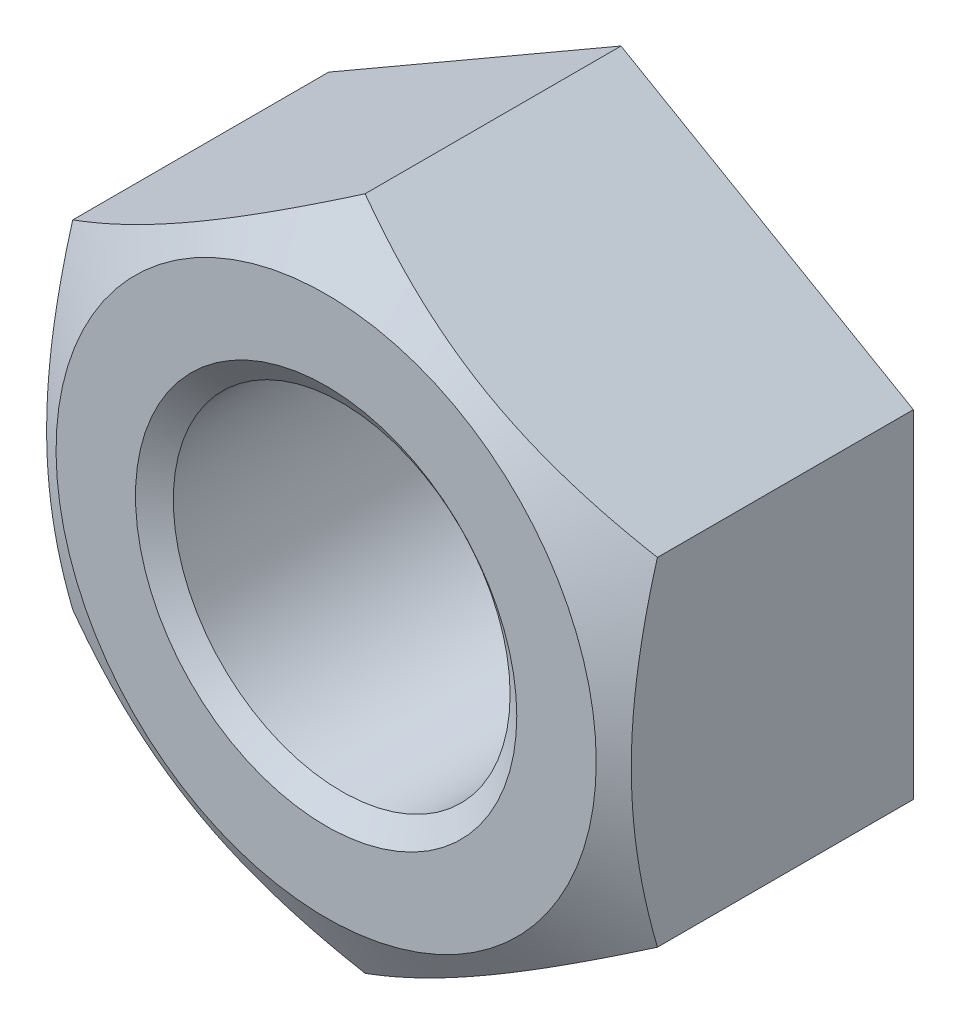
ISO-10303-21;
HEADER;
FILE_DESCRIPTION(('STEP AP214'),'2;1');
FILE_NAME('part.step','',(''),(''),'','','');
FILE_SCHEMA(('AUTOMOTIVE_DESIGN { 1 0 10303 214 1 1 1 1 }'));
ENDSEC;
DATA;
#1=APPLICATION_CONTEXT('core data for automotive mechanical design processes');
#2=APPLICATION_PROTOCOL_DEFINITION('international standard','automotive_design',2000,#1);
#3=PRODUCT_CONTEXT('',#1,'mechanical');
#4=PRODUCT('Part','Part','',(#3));
#5=PRODUCT_RELATED_PRODUCT_CATEGORY('part','',(#4));
#6=PRODUCT_DEFINITION_FORMATION('','',#4);
#7=PRODUCT_DEFINITION_CONTEXT('part definition',#1,'design');
#8=PRODUCT_DEFINITION('design','',#6,#7);
#9=PRODUCT_DEFINITION_SHAPE('','',#8);
#10=(LENGTH_UNIT() NAMED_UNIT(*) SI_UNIT(.MILLI.,.METRE.));
#11=(NAMED_UNIT(*) PLANE_ANGLE_UNIT() SI_UNIT($,.RADIAN.));
#12=(NAMED_UNIT(*) SI_UNIT($,.STERADIAN.) SOLID_ANGLE_UNIT());
#13=UNCERTAINTY_MEASURE_WITH_UNIT(LENGTH_MEASURE(1.E-05),#10,'distance_accuracy_value','');
#14=(GEOMETRIC_REPRESENTATION_CONTEXT(3) GLOBAL_UNCERTAINTY_ASSIGNED_CONTEXT((#13)) GLOBAL_UNIT_ASSIGNED_CONTEXT((#10,
#11,#12)) REPRESENTATION_CONTEXT('',''));
#15=CARTESIAN_POINT('',(0.,0.,0.));
#16=DIRECTION('',(0.,0.,1.));
#17=DIRECTION('',(1.,0.,0.));
#18=AXIS2_PLACEMENT_3D('',#15,#16,#17);
#19=CARTESIAN_POINT('',(0.,0.,-24.));
#20=DIRECTION('',(0.,0.,1.));
#21=DIRECTION('',(1.,0.,0.));
#22=AXIS2_PLACEMENT_3D('',#19,#20,#21);
#23=CYLINDRICAL_SURFACE('',#22,13.25);
#24=CARTESIAN_POINT('',(0.,0.,-1.22536319186699));
#25=DIRECTION('',(0.,0.,1.));
#26=DIRECTION('',(1.,0.,0.));
#27=AXIS2_PLACEMENT_3D('',#24,#25,#26);
#28=CIRCLE('',#27,13.25);
#29=CARTESIAN_POINT('',(13.25,0.,-1.22536319186699));
#30=VERTEX_POINT('',#29);
#31=EDGE_CURVE('E157',#30,#30,#28,.F.);
#32=ORIENTED_EDGE('',*,*,#31,.F.);
#33=EDGE_LOOP('',(#32));
#34=FACE_BOUND('',#33,.T.);
#35=CARTESIAN_POINT('',(0.,0.,-22.749236808133));
#36=DIRECTION('',(0.,0.,-1.));
#37=DIRECTION('',(-1.,0.,0.));
#38=AXIS2_PLACEMENT_3D('',#35,#36,#37);
#39=CIRCLE('',#38,13.25);
#40=CARTESIAN_POINT('',(-13.25,0.,-22.749236808133));
#41=VERTEX_POINT('',#40);
#42=EDGE_CURVE('E60',#41,#41,#39,.F.);
#43=ORIENTED_EDGE('',*,*,#42,.F.);
#44=EDGE_LOOP('',(#43));
#45=FACE_BOUND('',#44,.T.);
#46=ADVANCED_FACE('F55',(#34,#45),#23,.F.);
#47=CARTESIAN_POINT('',(0.,26.5581123827228,-24.));
#48=DIRECTION('',(-0.500000000000001,0.866025403784438,0.));
#49=DIRECTION('',(-0.866025403784438,-0.500000000000001,0.));
#50=AXIS2_PLACEMENT_3D('',#47,#48,#49);
#51=PLANE('',#50);
#52=DIRECTION('',(0.,0.,1.));
#53=VECTOR('',#52,1.);
#54=CARTESIAN_POINT('',(-23.,13.2790561913614,-24.));
#55=LINE('',#54,#53);
#56=CARTESIAN_POINT('',(-23.,13.2790561913614,-23.2));
#57=VERTEX_POINT('',#56);
#58=CARTESIAN_POINT('',(-23.,13.2790561913614,-3.06464011305381));
#59=VERTEX_POINT('',#58);
#60=EDGE_CURVE('E152',#57,#59,#55,.T.);
#61=ORIENTED_EDGE('',*,*,#60,.T.);
#62=CARTESIAN_POINT('',(-23.0002,13.2789407213075,-3.06470678015524));
#63=CARTESIAN_POINT('',(-22.4946699373268,13.5708086390754,-2.89620896296567));
#64=CARTESIAN_POINT('',(-21.9871680382127,13.8638149971431,-2.73535736277619));
#65=CARTESIAN_POINT('',(-20.9680946831029,14.4521772730397,-2.43107196426031));
#66=CARTESIAN_POINT('',(-20.4565219472494,14.7475339297949,-2.28764389460049));
#67=CARTESIAN_POINT('',(-19.4283073174286,15.3411739231066,-2.0201306965839));
#68=CARTESIAN_POINT('',(-18.9116563435469,15.6394625019543,-1.89609176031476));
#69=CARTESIAN_POINT('',(-17.874786357377,16.2380996675841,-1.67002891387056));
#70=CARTESIAN_POINT('',(-17.3545677058637,16.5384480460728,-1.56800281059486));
#71=CARTESIAN_POINT('',(-16.3238595850214,17.133527657097,-1.390296488012));
#72=CARTESIAN_POINT('',(-15.8134465686197,17.4282147495145,-1.31402859412605));
#73=CARTESIAN_POINT('',(-14.7902817837407,18.0189392134896,-1.18614472419415));
#74=CARTESIAN_POINT('',(-14.2775299704369,18.3149766109281,-1.13452922267139));
#75=CARTESIAN_POINT('',(-13.2511650180465,18.9075486924775,-1.05725340300737));
#76=CARTESIAN_POINT('',(-12.737553632351,19.2040823642676,-1.03156224268942));
#77=CARTESIAN_POINT('',(-11.709856889637,19.7974233553189,-1.00668758772433));
#78=CARTESIAN_POINT('',(-11.1957715477555,20.0942306658406,-1.0075032739647));
#79=CARTESIAN_POINT('',(-10.2346805073992,20.649116836706,-1.0337909434809));
#80=CARTESIAN_POINT('',(-9.78760635936283,20.9072352164226,-1.05605737734965));
#81=CARTESIAN_POINT('',(-8.89452539422337,21.422855752054,-1.12021466271131));
#82=CARTESIAN_POINT('',(-8.44851856192501,21.6803579167418,-1.16210523312609));
#83=CARTESIAN_POINT('',(-7.5577370141797,22.1946508831217,-1.26478478301267));
#84=CARTESIAN_POINT('',(-7.11296378131639,22.4514408288437,-1.3255908517859));
#85=CARTESIAN_POINT('',(-6.22554696928939,22.9637911641509,-1.46502523267661));
#86=CARTESIAN_POINT('',(-5.78290338111063,23.219351558941,-1.54365346928278));
#87=CARTESIAN_POINT('',(-4.43913170576541,23.9951784974309,-1.80828930440615));
#88=CARTESIAN_POINT('',(-3.54182151529442,24.513240777446,-2.02069846338397));
#89=CARTESIAN_POINT('',(-2.20576568085544,25.2846129731117,-2.38231509147428));
#90=CARTESIAN_POINT('',(-1.76244815667233,25.5405624650353,-2.50989098907509));
#91=CARTESIAN_POINT('',(-0.878879475119298,26.0506910811774,-2.77795827117694));
#92=CARTESIAN_POINT('',(-0.438627490903587,26.3048706827757,-2.9184460154237));
#93=CARTESIAN_POINT('',(0.000199999999999214,26.5582278527766,-3.06470678015525));
#94=B_SPLINE_CURVE_WITH_KNOTS('',3,(#62,#63,#64,#65,#66,#67,#68,#69,#70,#71,#72,#73,#74,#75,#76,
#77,#78,#79,#80,#81,#82,#83,#84,#85,#86,#87,#88,#89,#90,#91,#92,#93),.UNSPECIFIED.,.F.,.F.,(4,2,
2,2,2,2,2,2,2,2,2,2,2,2,2,4),(0.,1.82275209583971,3.64610187987774,5.47373144334345,
7.30117883905959,9.08355891739023,10.8659733025976,12.6462646412199,14.4265009654718,
15.9762768881921,17.5260306140232,19.0771885590146,20.6283399319781,23.7989683744784,
25.381520854309,26.9636285236953),.UNSPECIFIED.);
#95=CARTESIAN_POINT('',(0.,26.5581123827228,-3.06464011305381));
#96=VERTEX_POINT('',#95);
#97=EDGE_CURVE('E74',#59,#96,#94,.T.);
#98=ORIENTED_EDGE('',*,*,#97,.T.);
#99=DIRECTION('',(0.,0.,1.));
#100=VECTOR('',#99,1.);
#101=CARTESIAN_POINT('',(0.,26.5581123827228,-24.));
#102=LINE('',#101,#100);
#103=CARTESIAN_POINT('',(0.,26.5581123827228,-23.2));
#104=VERTEX_POINT('',#103);
#105=EDGE_CURVE('E66',#104,#96,#102,.T.);
#106=ORIENTED_EDGE('',*,*,#105,.F.);
#107=DIRECTION('',(-0.866025403784438,-0.500000000000001,0.));
#108=VECTOR('',#107,1.);
#109=CARTESIAN_POINT('',(0.,26.5581123827228,-23.2));
#110=LINE('',#109,#108);
#111=EDGE_CURVE('E155',#104,#57,#110,.T.);
#112=ORIENTED_EDGE('',*,*,#111,.T.);
#113=EDGE_LOOP('',(#61,#98,#106,#112));
#114=FACE_BOUND('',#113,.T.);
#115=ADVANCED_FACE('F57',(#114),#51,.T.);
#116=CARTESIAN_POINT('',(23.,13.2790561913614,-24.));
#117=DIRECTION('',(0.500000000000001,0.866025403784438,0.));
#118=DIRECTION('',(-0.866025403784438,0.500000000000001,0.));
#119=AXIS2_PLACEMENT_3D('',#116,#117,#118);
#120=PLANE('',#119);
#121=ORIENTED_EDGE('',*,*,#105,.T.);
#122=CARTESIAN_POINT('',(-0.000199999999998314,26.5582278527766,-3.06470678015525));
#123=CARTESIAN_POINT('',(0.505330062673217,26.2663599350088,-2.89620896296568));
#124=CARTESIAN_POINT('',(1.01283196178731,25.973353576941,-2.73535736277621));
#125=CARTESIAN_POINT('',(2.03190531689708,25.3849913010444,-2.43107196426032));
#126=CARTESIAN_POINT('',(2.54347805275062,25.0896346442893,-2.2876438946005));
#127=CARTESIAN_POINT('',(3.57169268257138,24.4959946509776,-2.02013069658391));
#128=CARTESIAN_POINT('',(4.08834365645312,24.1977060721299,-1.89609176031477));
#129=CARTESIAN_POINT('',(5.12521364262298,23.5990689065001,-1.67002891387056));
#130=CARTESIAN_POINT('',(5.64543229413635,23.2987205280114,-1.56800281059487));
#131=CARTESIAN_POINT('',(6.67614041497861,22.7036409169872,-1.390296488012));
#132=CARTESIAN_POINT('',(7.18655343138035,22.4089538245697,-1.31402859412605));
#133=CARTESIAN_POINT('',(8.20971821625926,21.8182293605945,-1.18614472419416));
#134=CARTESIAN_POINT('',(8.72247002956314,21.5221919631561,-1.13452922267139));
#135=CARTESIAN_POINT('',(9.74883498195349,20.9296198816067,-1.05725340300737));
#136=CARTESIAN_POINT('',(10.262446367649,20.6330862098165,-1.03156224268942));
#137=CARTESIAN_POINT('',(11.290143110363,20.0397452187653,-1.00668758772433));
#138=CARTESIAN_POINT('',(11.8042284522445,19.7429379082436,-1.0075032739647));
#139=CARTESIAN_POINT('',(12.7653194926008,19.1880517373781,-1.03379094348089));
#140=CARTESIAN_POINT('',(13.2123936406372,18.9299333576616,-1.05605737734965));
#141=CARTESIAN_POINT('',(14.1054746057766,18.4143128220302,-1.1202146627113));
#142=CARTESIAN_POINT('',(14.551481438075,18.1568106573423,-1.16210523312609));
#143=CARTESIAN_POINT('',(15.4422629858203,17.6425176909624,-1.26478478301267));
#144=CARTESIAN_POINT('',(15.8870362186836,17.3857277452405,-1.32559085178589));
#145=CARTESIAN_POINT('',(16.7744530307106,16.8733774099333,-1.4650252326766));
#146=CARTESIAN_POINT('',(17.2170966188894,16.6178170151432,-1.54365346928277));
#147=CARTESIAN_POINT('',(18.5608682942346,15.8419900766532,-1.80828930440614));
#148=CARTESIAN_POINT('',(19.4581784847056,15.3239277966382,-2.02069846338396));
#149=CARTESIAN_POINT('',(20.7942343191446,14.5525556009725,-2.38231509147426));
#150=CARTESIAN_POINT('',(21.2375518433277,14.2966061090489,-2.50989098907507));
#151=CARTESIAN_POINT('',(22.1211205248807,13.7864774929067,-2.77795827117692));
#152=CARTESIAN_POINT('',(22.5613725090964,13.5322978913085,-2.91844601542368));
#153=CARTESIAN_POINT('',(23.0002,13.2789407213075,-3.06470678015524));
#154=B_SPLINE_CURVE_WITH_KNOTS('',3,(#122,#123,#124,#125,#126,#127,#128,#129,#130,#131,#132,
#133,#134,#135,#136,#137,#138,#139,#140,#141,#142,#143,#144,#145,#146,#147,#148,#149,#150,#151,
#152,#153),.UNSPECIFIED.,.F.,.F.,(4,2,2,2,2,2,2,2,2,2,2,2,2,2,2,4),(0.,1.82275209583972,
3.64610187987774,5.47373144334346,7.3011788390596,9.08355891739024,10.8659733025977,
12.6462646412199,14.4265009654718,15.9762768881921,17.5260306140232,19.0771885590147,
20.6283399319781,23.7989683744784,25.381520854309,26.9636285236953),.UNSPECIFIED.);
#155=CARTESIAN_POINT('',(23.,13.2790561913614,-3.06464011305381));
#156=VERTEX_POINT('',#155);
#157=EDGE_CURVE('E112',#96,#156,#154,.T.);
#158=ORIENTED_EDGE('',*,*,#157,.T.);
#159=DIRECTION('',(0.,0.,1.));
#160=VECTOR('',#159,1.);
#161=CARTESIAN_POINT('',(23.,13.2790561913614,-24.));
#162=LINE('',#161,#160);
#163=CARTESIAN_POINT('',(23.,13.2790561913614,-23.2));
#164=VERTEX_POINT('',#163);
#165=EDGE_CURVE('E126',#164,#156,#162,.T.);
#166=ORIENTED_EDGE('',*,*,#165,.F.);
#167=DIRECTION('',(-0.866025403784438,0.500000000000001,0.));
#168=VECTOR('',#167,1.);
#169=CARTESIAN_POINT('',(23.,13.2790561913614,-23.2));
#170=LINE('',#169,#168);
#171=EDGE_CURVE('E297',#164,#104,#170,.T.);
#172=ORIENTED_EDGE('',*,*,#171,.T.);
#173=EDGE_LOOP('',(#121,#158,#166,#172));
#174=FACE_BOUND('',#173,.T.);
#175=ADVANCED_FACE('F124',(#174),#120,.T.);
#176=CARTESIAN_POINT('',(23.,13.2790561913614,-24.));
#177=DIRECTION('',(-1.,0.,0.));
#178=DIRECTION('',(0.,0.,1.));
#179=AXIS2_PLACEMENT_3D('',#176,#177,#178);
#180=PLANE('',#179);
#181=CARTESIAN_POINT('',(23.,-35.0780685485282,-11.9488685417644));
#182=CARTESIAN_POINT('',(23.,-34.5737134076575,-11.7053639974233));
#183=CARTESIAN_POINT('',(23.,-34.0687442458396,-11.4631273123191));
#184=CARTESIAN_POINT('',(23.,-33.057448994533,-10.9814892515945));
#185=CARTESIAN_POINT('',(23.,-32.5511228899599,-10.7420879076548));
#186=CARTESIAN_POINT('',(23.,-31.5369087506203,-10.2663845898492));
#187=CARTESIAN_POINT('',(23.,-31.0290204617527,-10.0300831571396));
#188=CARTESIAN_POINT('',(23.,-30.0116313487155,-9.56098370794906));
#189=CARTESIAN_POINT('',(23.,-29.5021305287171,-9.32818568241469));
#190=CARTESIAN_POINT('',(23.,-27.9650624821132,-8.63295496672951));
#191=CARTESIAN_POINT('',(23.,-26.934799872794,-8.17644978276591));
#192=CARTESIAN_POINT('',(23.,-24.8657625137666,-7.28323976773637));
#193=CARTESIAN_POINT('',(23.,-23.8269882160104,-6.84653389331184));
#194=CARTESIAN_POINT('',(23.,-21.7270262329022,-5.99329263988917));
#195=CARTESIAN_POINT('',(23.,-20.665718406379,-5.57705134364039));
#196=CARTESIAN_POINT('',(23.,-18.5305279669218,-4.77751797307565));
#197=CARTESIAN_POINT('',(23.,-17.4566439650014,-4.39422957801947));
#198=CARTESIAN_POINT('',(23.,-15.2968805955229,-3.671008456395));
#199=CARTESIAN_POINT('',(23.,-14.2110327691444,-3.33098231768915));
#200=CARTESIAN_POINT('',(23.,-12.0238020945178,-2.70540300528951));
#201=CARTESIAN_POINT('',(23.,-10.9224243154918,-2.41983247911325));
#202=CARTESIAN_POINT('',(23.,-9.25849113099518,-2.04283349441315));
#203=CARTESIAN_POINT('',(23.,-8.70171998903924,-1.92570242599273));
#204=CARTESIAN_POINT('',(23.,-7.58450066355028,-1.71042696624684));
#205=CARTESIAN_POINT('',(23.,-7.02405256448527,-1.61228214033255));
#206=CARTESIAN_POINT('',(23.,-5.89986571988708,-1.43672700236951));
#207=CARTESIAN_POINT('',(23.,-5.33612676901825,-1.35931799859115));
#208=CARTESIAN_POINT('',(23.,-4.20601541066591,-1.22679384417972));
#209=CARTESIAN_POINT('',(23.,-3.63964299967368,-1.17167872325869));
#210=CARTESIAN_POINT('',(23.,-2.50860433755947,-1.08521863338888));
#211=CARTESIAN_POINT('',(23.,-1.9439492548038,-1.05372851585493));
#212=CARTESIAN_POINT('',(23.,-0.813815198672231,-1.01468181033294));
#213=CARTESIAN_POINT('',(23.,-0.248336237714084,-1.00712486527476));
#214=CARTESIAN_POINT('',(23.,0.882278627431273,-1.01612299200431));
#215=CARTESIAN_POINT('',(23.,1.44741458303895,-1.03267154214538));
#216=CARTESIAN_POINT('',(23.,2.57649778968015,-1.08947358836765));
#217=CARTESIAN_POINT('',(23.,3.14044498714785,-1.12972813066345));
#218=CARTESIAN_POINT('',(23.,4.51138271439505,-1.25556667792754));
#219=CARTESIAN_POINT('',(23.,5.31727996380217,-1.35325616120192));
#220=CARTESIAN_POINT('',(23.,6.92270827199991,-1.59157778269746));
#221=CARTESIAN_POINT('',(23.,7.72223834940541,-1.73221641416693));
#222=CARTESIAN_POINT('',(23.,9.31536949287209,-2.05164992700284));
#223=CARTESIAN_POINT('',(23.,10.1089539551621,-2.23052683693231));
#224=CARTESIAN_POINT('',(23.,11.6879535318714,-2.62088944290861));
#225=CARTESIAN_POINT('',(23.,12.473368959441,-2.83237388403015));
#226=CARTESIAN_POINT('',(23.,14.054330482054,-3.28812927965131));
#227=CARTESIAN_POINT('',(23.,14.8496888400882,-3.5330470750076));
#228=CARTESIAN_POINT('',(23.,16.432613979667,-4.04696815224279));
#229=CARTESIAN_POINT('',(23.,17.2201800574553,-4.31597358792968));
#230=CARTESIAN_POINT('',(23.,18.7837276690136,-4.87240341593903));
#231=CARTESIAN_POINT('',(23.,19.5597495501225,-5.15971486699964));
#232=CARTESIAN_POINT('',(23.,20.7189059740751,-5.60297383967549));
#233=CARTESIAN_POINT('',(23.,21.1044177153146,-5.75275063491177));
#234=CARTESIAN_POINT('',(23.,21.8739460954076,-6.05606747576747));
#235=CARTESIAN_POINT('',(23.,22.2579627756814,-6.20960741625735));
#236=CARTESIAN_POINT('',(23.,22.6412868548486,-6.36485958501893));
#237=B_SPLINE_CURVE_WITH_KNOTS('',3,(#181,#182,#183,#184,#185,#186,#187,#188,#189,#190,#191,
#192,#193,#194,#195,#196,#197,#198,#199,#200,#201,#202,#203,#204,#205,#206,#207,#208,#209,#210,
#211,#212,#213,#214,#215,#216,#217,#218,#219,#220,#221,#222,#223,#224,#225,#226,#227,#228,#229,
#230,#231,#232,#233,#234,#235,#236),.UNSPECIFIED.,.F.,.F.,(4,2,2,2,2,2,2,2,2,2,2,2,2,2,2,2,2,2,
2,2,2,2,2,2,2,2,2,4),(0.,1.68018429060688,3.36038733702288,5.04087989701004,6.72136811354165,
10.1018080469805,13.4820696347919,16.9016918489926,20.3216953766028,23.7341843526804,
27.1455841027292,28.8521879660643,30.558752761177,32.2654252020159,33.972099917406,
35.6682012134936,37.3642772045373,39.059894414128,40.7555864618619,43.1896176563215,
45.6240170210583,48.0636920140398,50.5032731377259,52.9994549998903,55.4958602826676,
57.9781275126519,59.2188660428203,60.4595699503733),.UNSPECIFIED.);
#238=CARTESIAN_POINT('',(23.,-13.2790561913614,-3.06464011305381));
#239=VERTEX_POINT('',#238);
#240=EDGE_CURVE('E109',#239,#156,#237,.T.);
#241=ORIENTED_EDGE('',*,*,#240,.F.);
#242=DIRECTION('',(0.,0.,1.));
#243=VECTOR('',#242,1.);
#244=CARTESIAN_POINT('',(23.,-13.2790561913614,-24.));
#245=LINE('',#244,#243);
#246=CARTESIAN_POINT('',(23.,-13.2790561913614,-23.2));
#247=VERTEX_POINT('',#246);
#248=EDGE_CURVE('E134',#247,#239,#245,.T.);
#249=ORIENTED_EDGE('',*,*,#248,.F.);
#250=DIRECTION('',(0.,-1.,0.));
#251=VECTOR('',#250,1.);
#252=CARTESIAN_POINT('',(23.,13.2790561913614,-23.2));
#253=LINE('',#252,#251);
#254=EDGE_CURVE('E132',#164,#247,#253,.T.);
#255=ORIENTED_EDGE('',*,*,#254,.F.);
#256=ORIENTED_EDGE('',*,*,#165,.T.);
#257=EDGE_LOOP('',(#241,#249,#255,#256));
#258=FACE_BOUND('',#257,.T.);
#259=ADVANCED_FACE('F131',(#258),#180,.F.);
#260=CARTESIAN_POINT('',(0.,-26.5581123827229,-24.));
#261=DIRECTION('',(0.500000000000001,-0.866025403784438,0.));
#262=DIRECTION('',(0.866025403784438,0.500000000000001,0.));
#263=AXIS2_PLACEMENT_3D('',#260,#261,#262);
#264=PLANE('',#263);
#265=ORIENTED_EDGE('',*,*,#248,.T.);
#266=CARTESIAN_POINT('',(23.0002,-13.2789407213076,-3.06470678015525));
#267=CARTESIAN_POINT('',(22.4946699373268,-13.5708086390754,-2.89620896296569));
#268=CARTESIAN_POINT('',(21.9871680382127,-13.8638149971432,-2.73535736277621));
#269=CARTESIAN_POINT('',(20.9680946831029,-14.4521772730398,-2.43107196426032));
#270=CARTESIAN_POINT('',(20.4565219472494,-14.7475339297949,-2.2876438946005));
#271=CARTESIAN_POINT('',(19.4283073174286,-15.3411739231066,-2.02013069658392));
#272=CARTESIAN_POINT('',(18.9116563435469,-15.6394625019544,-1.89609176031478));
#273=CARTESIAN_POINT('',(17.874786357377,-16.2380996675842,-1.67002891387057));
#274=CARTESIAN_POINT('',(17.3545677058636,-16.5384480460729,-1.56800281059488));
#275=CARTESIAN_POINT('',(16.3238595850214,-17.1335276570971,-1.39029648801201));
#276=CARTESIAN_POINT('',(15.8134465686196,-17.4282147495145,-1.31402859412607));
#277=CARTESIAN_POINT('',(14.7902817837407,-18.0189392134897,-1.18614472419417));
#278=CARTESIAN_POINT('',(14.2775299704369,-18.3149766109282,-1.13452922267141));
#279=CARTESIAN_POINT('',(13.2511650180465,-18.9075486924775,-1.05725340300739));
#280=CARTESIAN_POINT('',(12.737553632351,-19.2040823642677,-1.03156224268944));
#281=CARTESIAN_POINT('',(11.7098568896369,-19.797423355319,-1.00668758772435));
#282=CARTESIAN_POINT('',(11.1957715477555,-20.0942306658407,-1.00750327396473));
#283=CARTESIAN_POINT('',(10.2346805073992,-20.6491168367061,-1.03379094348092));
#284=CARTESIAN_POINT('',(9.78760635936281,-20.9072352164226,-1.05605737734968));
#285=CARTESIAN_POINT('',(8.89452539422335,-21.422855752054,-1.12021466271134));
#286=CARTESIAN_POINT('',(8.44851856192499,-21.6803579167419,-1.16210523312612));
#287=CARTESIAN_POINT('',(7.55773701417968,-22.1946508831218,-1.2647847830127));
#288=CARTESIAN_POINT('',(7.11296378131638,-22.4514408288438,-1.32559085178593));
#289=CARTESIAN_POINT('',(6.22554696928937,-22.963791164151,-1.46502523267664));
#290=CARTESIAN_POINT('',(5.78290338111063,-23.219351558941,-1.54365346928281));
#291=CARTESIAN_POINT('',(4.4391317057654,-23.995178497431,-1.80828930440618));
#292=CARTESIAN_POINT('',(3.54182151529441,-24.513240777446,-2.020698463384));
#293=CARTESIAN_POINT('',(2.20576568085544,-25.2846129731117,-2.38231509147431));
#294=CARTESIAN_POINT('',(1.76244815667232,-25.5405624650353,-2.50989098907512));
#295=CARTESIAN_POINT('',(0.878879475119292,-26.0506910811775,-2.77795827117697));
#296=CARTESIAN_POINT('',(0.438627490903583,-26.3048706827757,-2.91844601542373));
#297=CARTESIAN_POINT('',(-0.000200000000003083,-26.5582278527767,-3.06470678015528));
#298=B_SPLINE_CURVE_WITH_KNOTS('',3,(#266,#267,#268,#269,#270,#271,#272,#273,#274,#275,#276,
#277,#278,#279,#280,#281,#282,#283,#284,#285,#286,#287,#288,#289,#290,#291,#292,#293,#294,#295,
#296,#297),.UNSPECIFIED.,.F.,.F.,(4,2,2,2,2,2,2,2,2,2,2,2,2,2,2,4),(0.,1.82275209583972,
3.64610187987774,5.47373144334346,7.30117883905961,9.08355891739025,10.8659733025977,
12.6462646412199,14.4265009654718,15.9762768881922,17.5260306140232,19.0771885590147,
20.6283399319781,23.7989683744784,25.381520854309,26.9636285236953),.UNSPECIFIED.);
#299=CARTESIAN_POINT('',(0.,-26.5581123827228,-3.06464011305381));
#300=VERTEX_POINT('',#299);
#301=EDGE_CURVE('E114',#239,#300,#298,.T.);
#302=ORIENTED_EDGE('',*,*,#301,.T.);
#303=DIRECTION('',(0.,0.,1.));
#304=VECTOR('',#303,1.);
#305=CARTESIAN_POINT('',(0.,-26.5581123827229,-24.));
#306=LINE('',#305,#304);
#307=CARTESIAN_POINT('',(0.,-26.5581123827229,-23.2));
#308=VERTEX_POINT('',#307);
#309=EDGE_CURVE('E141',#308,#300,#306,.T.);
#310=ORIENTED_EDGE('',*,*,#309,.F.);
#311=DIRECTION('',(0.866025403784438,0.500000000000001,0.));
#312=VECTOR('',#311,1.);
#313=CARTESIAN_POINT('',(0.,-26.5581123827229,-23.2));
#314=LINE('',#313,#312);
#315=EDGE_CURVE('E288',#308,#247,#314,.T.);
#316=ORIENTED_EDGE('',*,*,#315,.T.);
#317=EDGE_LOOP('',(#265,#302,#310,#316));
#318=FACE_BOUND('',#317,.T.);
#319=ADVANCED_FACE('F245',(#318),#264,.T.);
#320=CARTESIAN_POINT('',(-23.,-13.2790561913614,-24.));
#321=DIRECTION('',(-0.500000000000001,-0.866025403784438,0.));
#322=DIRECTION('',(0.866025403784438,-0.500000000000001,0.));
#323=AXIS2_PLACEMENT_3D('',#320,#321,#322);
#324=PLANE('',#323);
#325=ORIENTED_EDGE('',*,*,#309,.T.);
#326=CARTESIAN_POINT('',(0.000199999999995261,-26.5582278527767,-3.06470678015528));
#327=CARTESIAN_POINT('',(-0.50533006267322,-26.2663599350089,-2.89620896296571));
#328=CARTESIAN_POINT('',(-1.01283196178731,-25.9733535769411,-2.73535736277624));
#329=CARTESIAN_POINT('',(-2.03190531689708,-25.3849913010445,-2.43107196426035));
#330=CARTESIAN_POINT('',(-2.54347805275063,-25.0896346442894,-2.28764389460053));
#331=CARTESIAN_POINT('',(-3.57169268257139,-24.4959946509776,-2.02013069658394));
#332=CARTESIAN_POINT('',(-4.08834365645313,-24.1977060721299,-1.8960917603148));
#333=CARTESIAN_POINT('',(-5.12521364262299,-23.5990689065001,-1.67002891387059));
#334=CARTESIAN_POINT('',(-5.64543229413636,-23.2987205280114,-1.5680028105949));
#335=CARTESIAN_POINT('',(-6.67614041497862,-22.7036409169872,-1.39029648801203));
#336=CARTESIAN_POINT('',(-7.18655343138037,-22.4089538245698,-1.31402859412608));
#337=CARTESIAN_POINT('',(-8.20971821625928,-21.8182293605946,-1.18614472419418));
#338=CARTESIAN_POINT('',(-8.72247002956315,-21.5221919631561,-1.13452922267142));
#339=CARTESIAN_POINT('',(-9.74883498195351,-20.9296198816067,-1.0572534030074));
#340=CARTESIAN_POINT('',(-10.262446367649,-20.6330862098166,-1.03156224268945));
#341=CARTESIAN_POINT('',(-11.2901431103631,-20.0397452187653,-1.00668758772435));
#342=CARTESIAN_POINT('',(-11.8042284522445,-19.7429379082436,-1.00750327396473));
#343=CARTESIAN_POINT('',(-12.7653194926008,-19.1880517373782,-1.03379094348092));
#344=CARTESIAN_POINT('',(-13.2123936406372,-18.9299333576616,-1.05605737734967));
#345=CARTESIAN_POINT('',(-14.1054746057767,-18.4143128220302,-1.12021466271133));
#346=CARTESIAN_POINT('',(-14.551481438075,-18.1568106573424,-1.16210523312611));
#347=CARTESIAN_POINT('',(-15.4422629858203,-17.6425176909625,-1.26478478301269));
#348=CARTESIAN_POINT('',(-15.8870362186836,-17.3857277452405,-1.32559085178592));
#349=CARTESIAN_POINT('',(-16.7744530307106,-16.8733774099333,-1.46502523267663));
#350=CARTESIAN_POINT('',(-17.2170966188894,-16.6178170151432,-1.54365346928279));
#351=CARTESIAN_POINT('',(-18.5608682942346,-15.8419900766533,-1.80828930440616));
#352=CARTESIAN_POINT('',(-19.4581784847056,-15.3239277966383,-2.02069846338398));
#353=CARTESIAN_POINT('',(-20.7942343191446,-14.5525556009726,-2.38231509147428));
#354=CARTESIAN_POINT('',(-21.2375518433277,-14.296606109049,-2.50989098907509));
#355=CARTESIAN_POINT('',(-22.1211205248807,-13.7864774929068,-2.77795827117694));
#356=CARTESIAN_POINT('',(-22.5613725090964,-13.5322978913086,-2.9184460154237));
#357=CARTESIAN_POINT('',(-23.0002,-13.2789407213076,-3.06470678015525));
#358=B_SPLINE_CURVE_WITH_KNOTS('',3,(#326,#327,#328,#329,#330,#331,#332,#333,#334,#335,#336,
#337,#338,#339,#340,#341,#342,#343,#344,#345,#346,#347,#348,#349,#350,#351,#352,#353,#354,#355,
#356,#357),.UNSPECIFIED.,.F.,.F.,(4,2,2,2,2,2,2,2,2,2,2,2,2,2,2,4),(0.,1.82275209583972,
3.64610187987775,5.47373144334346,7.30117883905962,9.08355891739026,10.8659733025977,
12.64626464122,14.4265009654719,15.9762768881922,17.5260306140232,19.0771885590147,
20.6283399319782,23.7989683744784,25.381520854309,26.9636285236953),.UNSPECIFIED.);
#359=CARTESIAN_POINT('',(-23.,-13.2790561913614,-3.06464011305381));
#360=VERTEX_POINT('',#359);
#361=EDGE_CURVE('E194',#300,#360,#358,.T.);
#362=ORIENTED_EDGE('',*,*,#361,.T.);
#363=DIRECTION('',(0.,0.,1.));
#364=VECTOR('',#363,1.);
#365=CARTESIAN_POINT('',(-23.,-13.2790561913614,-24.));
#366=LINE('',#365,#364);
#367=CARTESIAN_POINT('',(-23.,-13.2790561913614,-23.2));
#368=VERTEX_POINT('',#367);
#369=EDGE_CURVE('E148',#368,#360,#366,.T.);
#370=ORIENTED_EDGE('',*,*,#369,.F.);
#371=DIRECTION('',(0.866025403784438,-0.500000000000001,0.));
#372=VECTOR('',#371,1.);
#373=CARTESIAN_POINT('',(-23.,-13.2790561913614,-23.2));
#374=LINE('',#373,#372);
#375=EDGE_CURVE('E82',#368,#308,#374,.T.);
#376=ORIENTED_EDGE('',*,*,#375,.T.);
#377=EDGE_LOOP('',(#325,#362,#370,#376));
#378=FACE_BOUND('',#377,.T.);
#379=ADVANCED_FACE('F248',(#378),#324,.T.);
#380=CARTESIAN_POINT('',(-23.,13.2790561913614,-24.));
#381=DIRECTION('',(-1.,0.,0.));
#382=DIRECTION('',(0.,-1.,0.));
#383=AXIS2_PLACEMENT_3D('',#380,#381,#382);
#384=PLANE('',#383);
#385=ORIENTED_EDGE('',*,*,#369,.T.);
#386=CARTESIAN_POINT('',(-23.,-35.0780685485578,-11.9488685417787));
#387=CARTESIAN_POINT('',(-23.,-34.5737134076866,-11.7053639974373));
#388=CARTESIAN_POINT('',(-23.,-34.0687442458682,-11.4631273123328));
#389=CARTESIAN_POINT('',(-23.,-33.0574489945605,-10.9814892516076));
#390=CARTESIAN_POINT('',(-23.,-32.5511228899869,-10.7420879076675));
#391=CARTESIAN_POINT('',(-23.,-31.5369087506464,-10.2663845898613));
#392=CARTESIAN_POINT('',(-23.,-31.0290204617783,-10.0300831571514));
#393=CARTESIAN_POINT('',(-23.,-30.0116313487401,-9.56098370796031));
#394=CARTESIAN_POINT('',(-23.,-29.5021305287412,-9.32818568242564));
#395=CARTESIAN_POINT('',(-23.,-27.9650624821357,-8.63295496673954));
#396=CARTESIAN_POINT('',(-23.,-26.9347998728155,-8.17644978277533));
#397=CARTESIAN_POINT('',(-23.,-24.8657625137859,-7.28323976774459));
#398=CARTESIAN_POINT('',(-23.,-23.8269882160287,-6.84653389331947));
#399=CARTESIAN_POINT('',(-23.,-21.7270262329185,-5.99329263989561));
#400=CARTESIAN_POINT('',(-23.,-20.6657184063942,-5.57705134364624));
#401=CARTESIAN_POINT('',(-23.,-18.5305279669348,-4.77751797308036));
#402=CARTESIAN_POINT('',(-23.,-17.4566439650133,-4.39422957802362));
#403=CARTESIAN_POINT('',(-23.,-15.2968805955326,-3.67100845639809));
#404=CARTESIAN_POINT('',(-23.,-14.211032769153,-3.33098231769175));
#405=CARTESIAN_POINT('',(-23.,-12.0238020945241,-2.7054030052912));
#406=CARTESIAN_POINT('',(-23.,-10.9224243154971,-2.41983247911453));
#407=CARTESIAN_POINT('',(-23.,-9.25849113099837,-2.04283349441383));
#408=CARTESIAN_POINT('',(-23.,-8.70171998904154,-1.92570242599319));
#409=CARTESIAN_POINT('',(-23.,-7.5845006635508,-1.71042696624692));
#410=CARTESIAN_POINT('',(-23.,-7.02405256448489,-1.61228214033248));
#411=CARTESIAN_POINT('',(-23.,-5.8998657198849,-1.43672700236918));
#412=CARTESIAN_POINT('',(-23.,-5.33612676901517,-1.35931799859074));
#413=CARTESIAN_POINT('',(-23.,-4.20601541066101,-1.2267938441792));
#414=CARTESIAN_POINT('',(-23.,-3.63964299966787,-1.17167872325816));
#415=CARTESIAN_POINT('',(-23.,-2.50860433755184,-1.08521863338839));
#416=CARTESIAN_POINT('',(-23.,-1.94394925479526,-1.05372851585451));
#417=CARTESIAN_POINT('',(-23.,-0.81381519866189,-1.01468181033272));
#418=CARTESIAN_POINT('',(-23.,-0.248336237702841,-1.00712486527468));
#419=CARTESIAN_POINT('',(-23.,0.882278627444311,-1.01612299200458));
#420=CARTESIAN_POINT('',(-23.,1.44741458305288,-1.03267154214587));
#421=CARTESIAN_POINT('',(-23.,2.57649778969585,-1.08947358836865));
#422=CARTESIAN_POINT('',(-23.,3.14044498716444,-1.12972813066473));
#423=CARTESIAN_POINT('',(-23.,4.51138271441305,-1.25556667792953));
#424=CARTESIAN_POINT('',(-23.,5.31727996382069,-1.35325616120432));
#425=CARTESIAN_POINT('',(-23.,6.92270827201945,-1.59157778270071));
#426=CARTESIAN_POINT('',(-23.,7.72223834942546,-1.73221641417061));
#427=CARTESIAN_POINT('',(-23.,9.31536949289312,-2.05164992700739));
#428=CARTESIAN_POINT('',(-23.,10.1089539551836,-2.23052683693731));
#429=CARTESIAN_POINT('',(-23.,11.6879535318939,-2.62088944291449));
#430=CARTESIAN_POINT('',(-23.,12.473368959464,-2.83237388403647));
#431=CARTESIAN_POINT('',(-23.,14.0543304820779,-3.28812927965851));
#432=CARTESIAN_POINT('',(-23.,14.8496888401126,-3.53304707501524));
#433=CARTESIAN_POINT('',(-23.,16.4326139796923,-4.04696815225129));
#434=CARTESIAN_POINT('',(-23.,17.2201800574811,-4.31597358793862));
#435=CARTESIAN_POINT('',(-23.,18.7837276690403,-4.8724034159488));
#436=CARTESIAN_POINT('',(-23.,19.5597495501497,-5.15971486700982));
#437=CARTESIAN_POINT('',(-23.,20.7189059741031,-5.60297383968628));
#438=CARTESIAN_POINT('',(-23.,21.1044177153428,-5.75275063492277));
#439=CARTESIAN_POINT('',(-23.,21.8739460954362,-6.05606747577886));
#440=CARTESIAN_POINT('',(-23.,22.2579627757103,-6.20960741626894));
#441=CARTESIAN_POINT('',(-23.,22.6412868548777,-6.36485958503072));
#442=B_SPLINE_CURVE_WITH_KNOTS('',3,(#386,#387,#388,#389,#390,#391,#392,#393,#394,#395,#396,
#397,#398,#399,#400,#401,#402,#403,#404,#405,#406,#407,#408,#409,#410,#411,#412,#413,#414,#415,
#416,#417,#418,#419,#420,#421,#422,#423,#424,#425,#426,#427,#428,#429,#430,#431,#432,#433,#434,
#435,#436,#437,#438,#439,#440,#441),.UNSPECIFIED.,.F.,.F.,(4,2,2,2,2,2,2,2,2,2,2,2,2,2,2,2,2,2,
2,2,2,2,2,2,2,2,2,4),(0.,1.68018429060864,3.36038733702641,5.04087989701534,6.72136811354871,
10.1018080469911,13.4820696348061,16.9016918490104,20.3216953766243,23.7341843527055,
27.1455841027579,28.8521879660957,30.5587527612112,32.2654252020528,33.9720999174456,
35.668201213536,37.3642772045823,39.0598944141757,40.7555864619123,43.1896176563736,
45.6240170211122,48.0636920140953,50.5032731377831,52.9994549999493,55.4958602827284,
57.9781275127144,59.2188660428837,60.4595699504376),.UNSPECIFIED.);
#443=EDGE_CURVE('E186',#360,#59,#442,.T.);
#444=ORIENTED_EDGE('',*,*,#443,.T.);
#445=ORIENTED_EDGE('',*,*,#60,.F.);
#446=DIRECTION('',(0.,-1.,0.));
#447=VECTOR('',#446,1.);
#448=CARTESIAN_POINT('',(-23.,13.2790561913614,-23.2));
#449=LINE('',#448,#447);
#450=EDGE_CURVE('E12',#57,#368,#449,.T.);
#451=ORIENTED_EDGE('',*,*,#450,.T.);
#452=EDGE_LOOP('',(#385,#444,#445,#451));
#453=FACE_BOUND('',#452,.T.);
#454=ADVANCED_FACE('F201',(#453),#384,.T.);
#455=CARTESIAN_POINT('',(0.,26.5581123827228,0.));
#456=DIRECTION('',(0.,0.,-1.));
#457=DIRECTION('',(-1.,0.,0.));
#458=AXIS2_PLACEMENT_3D('',#455,#456,#457);
#459=PLANE('',#458);
#460=CARTESIAN_POINT('',(0.,0.,0.));
#461=DIRECTION('',(0.,0.,1.));
#462=DIRECTION('',(1.,0.,0.));
#463=AXIS2_PLACEMENT_3D('',#460,#461,#462);
#464=CIRCLE('',#463,15.);
#465=CARTESIAN_POINT('',(15.,0.,0.));
#466=VERTEX_POINT('',#465);
#467=EDGE_CURVE('E161',#466,#466,#464,.T.);
#468=ORIENTED_EDGE('',*,*,#467,.F.);
#469=EDGE_LOOP('',(#468));
#470=FACE_BOUND('',#469,.T.);
#471=CARTESIAN_POINT('',(0.,0.,0.));
#472=DIRECTION('',(0.,0.,1.));
#473=DIRECTION('',(1.,0.,0.));
#474=AXIS2_PLACEMENT_3D('',#471,#472,#473);
#475=CIRCLE('',#474,21.25);
#476=CARTESIAN_POINT('',(21.25,0.,0.));
#477=VERTEX_POINT('',#476);
#478=EDGE_CURVE('E160',#477,#477,#475,.T.);
#479=ORIENTED_EDGE('',*,*,#478,.T.);
#480=EDGE_LOOP('',(#479));
#481=FACE_BOUND('',#480,.T.);
#482=ADVANCED_FACE('F241',(#470,#481),#459,.F.);
#483=CARTESIAN_POINT('',(0.,26.5581123827228,-24.));
#484=DIRECTION('',(0.,0.,-1.));
#485=DIRECTION('',(-1.,0.,0.));
#486=AXIS2_PLACEMENT_3D('',#483,#484,#485);
#487=PLANE('',#486);
#488=CARTESIAN_POINT('',(0.,0.,-24.));
#489=DIRECTION('',(0.,0.,-1.));
#490=DIRECTION('',(-1.,0.,0.));
#491=AXIS2_PLACEMENT_3D('',#488,#489,#490);
#492=CIRCLE('',#491,15.);
#493=CARTESIAN_POINT('',(-15.,0.,-24.));
#494=VERTEX_POINT('',#493);
#495=EDGE_CURVE('E162',#494,#494,#492,.F.);
#496=ORIENTED_EDGE('',*,*,#495,.T.);
#497=EDGE_LOOP('',(#496));
#498=FACE_BOUND('',#497,.T.);
#499=CARTESIAN_POINT('',(0.,0.,-24.));
#500=DIRECTION('',(0.,0.,1.));
#501=DIRECTION('',(1.,0.,0.));
#502=AXIS2_PLACEMENT_3D('',#499,#500,#501);
#503=CIRCLE('',#502,21.25);
#504=CARTESIAN_POINT('',(21.25,0.,-24.));
#505=VERTEX_POINT('',#504);
#506=EDGE_CURVE('E279',#505,#505,#503,.T.);
#507=ORIENTED_EDGE('',*,*,#506,.F.);
#508=EDGE_LOOP('',(#507));
#509=FACE_BOUND('',#508,.T.);
#510=ADVANCED_FACE('F267',(#498,#509),#487,.T.);
#511=CARTESIAN_POINT('',(0.,0.,0.));
#512=DIRECTION('',(0.,0.,1.));
#513=DIRECTION('',(1.,0.,0.));
#514=AXIS2_PLACEMENT_3D('',#511,#512,#513);
#515=CYLINDRICAL_SURFACE('',#514,21.25);
#516=CARTESIAN_POINT('',(0.,0.,-23.2));
#517=DIRECTION('',(0.,0.,1.));
#518=DIRECTION('',(1.,0.,0.));
#519=AXIS2_PLACEMENT_3D('',#516,#517,#518);
#520=CIRCLE('',#519,21.25);
#521=CARTESIAN_POINT('',(21.25,0.,-23.2));
#522=VERTEX_POINT('',#521);
#523=EDGE_CURVE('E282',#522,#522,#520,.T.);
#524=ORIENTED_EDGE('',*,*,#523,.F.);
#525=EDGE_LOOP('',(#524));
#526=FACE_BOUND('',#525,.T.);
#527=ORIENTED_EDGE('',*,*,#506,.T.);
#528=EDGE_LOOP('',(#527));
#529=FACE_BOUND('',#528,.T.);
#530=ADVANCED_FACE('F266',(#526,#529),#515,.T.);
#531=CARTESIAN_POINT('',(0.,36.5581123827228,-23.2));
#532=DIRECTION('',(0.,0.,-1.));
#533=DIRECTION('',(-1.,0.,0.));
#534=AXIS2_PLACEMENT_3D('',#531,#532,#533);
#535=PLANE('',#534);
#536=ORIENTED_EDGE('',*,*,#171,.F.);
#537=ORIENTED_EDGE('',*,*,#254,.T.);
#538=ORIENTED_EDGE('',*,*,#315,.F.);
#539=ORIENTED_EDGE('',*,*,#375,.F.);
#540=ORIENTED_EDGE('',*,*,#450,.F.);
#541=ORIENTED_EDGE('',*,*,#111,.F.);
#542=EDGE_LOOP('',(#536,#537,#538,#539,#540,#541));
#543=FACE_BOUND('',#542,.T.);
#544=ORIENTED_EDGE('',*,*,#523,.T.);
#545=EDGE_LOOP('',(#544));
#546=FACE_BOUND('',#545,.T.);
#547=ADVANCED_FACE('F208',(#543,#546),#535,.T.);
#548=CARTESIAN_POINT('',(0.,0.,0.));
#549=DIRECTION('',(0.,0.,-1.));
#550=DIRECTION('',(-1.,0.,0.));
#551=AXIS2_PLACEMENT_3D('',#548,#549,#550);
#552=CONICAL_SURFACE('',#551,21.25,1.0471975511966);
#553=ORIENTED_EDGE('',*,*,#478,.F.);
#554=EDGE_LOOP('',(#553));
#555=FACE_BOUND('',#554,.T.);
#556=ORIENTED_EDGE('',*,*,#443,.F.);
#557=ORIENTED_EDGE('',*,*,#361,.F.);
#558=ORIENTED_EDGE('',*,*,#301,.F.);
#559=ORIENTED_EDGE('',*,*,#240,.T.);
#560=ORIENTED_EDGE('',*,*,#157,.F.);
#561=ORIENTED_EDGE('',*,*,#97,.F.);
#562=EDGE_LOOP('',(#556,#557,#558,#559,#560,#561));
#563=FACE_BOUND('',#562,.T.);
#564=ADVANCED_FACE('F111',(#555,#563),#552,.T.);
#565=CARTESIAN_POINT('',(0.,0.,-1.34789951105369));
#566=DIRECTION('',(0.,0.,1.));
#567=DIRECTION('',(1.,0.,0.));
#568=AXIS2_PLACEMENT_3D('',#565,#566,#567);
#569=CONICAL_SURFACE('',#568,13.075,0.959931088596882);
#570=ORIENTED_EDGE('',*,*,#467,.T.);
#571=EDGE_LOOP('',(#570));
#572=FACE_BOUND('',#571,.T.);
#573=ORIENTED_EDGE('',*,*,#31,.T.);
#574=EDGE_LOOP('',(#573));
#575=FACE_BOUND('',#574,.T.);
#576=ADVANCED_FACE('F207',(#572,#575),#569,.F.);
#577=CARTESIAN_POINT('',(0.,0.,-23.9746));
#578=DIRECTION('',(0.,0.,-1.));
#579=DIRECTION('',(-1.,0.,0.));
#580=AXIS2_PLACEMENT_3D('',#577,#578,#579);
#581=CONICAL_SURFACE('',#580,15.,0.959931088596881);
#582=CARTESIAN_POINT('',(0.,0.,-23.9746));
#583=DIRECTION('',(0.,0.,1.));
#584=DIRECTION('',(1.,0.,0.));
#585=AXIS2_PLACEMENT_3D('',#582,#583,#584);
#586=CIRCLE('',#585,15.);
#587=CARTESIAN_POINT('',(15.,0.,-23.9746));
#588=VERTEX_POINT('',#587);
#589=EDGE_CURVE('E165',#588,#588,#586,.T.);
#590=ORIENTED_EDGE('',*,*,#589,.F.);
#591=EDGE_LOOP('',(#590));
#592=FACE_BOUND('',#591,.T.);
#593=ORIENTED_EDGE('',*,*,#42,.T.);
#594=EDGE_LOOP('',(#593));
#595=FACE_BOUND('',#594,.T.);
#596=ADVANCED_FACE('F384',(#592,#595),#581,.F.);
#597=CARTESIAN_POINT('',(0.,0.,-25.0375057290932));
#598=DIRECTION('',(0.,0.,1.));
#599=DIRECTION('',(1.,0.,0.));
#600=AXIS2_PLACEMENT_3D('',#597,#598,#599);
#601=CYLINDRICAL_SURFACE('',#600,15.);
#602=ORIENTED_EDGE('',*,*,#495,.F.);
#603=EDGE_LOOP('',(#602));
#604=FACE_BOUND('',#603,.T.);
#605=ORIENTED_EDGE('',*,*,#589,.T.);
#606=EDGE_LOOP('',(#605));
#607=FACE_BOUND('',#606,.T.);
#608=ADVANCED_FACE('F392',(#604,#607),#601,.F.);
#609=CLOSED_SHELL('',(#46,#115,#175,#259,#319,#379,#454,#482,#510,#530,#547,#564,#576,#596,#608));
#610=MANIFOLD_SOLID_BREP('B2',#609);
#611=ADVANCED_BREP_SHAPE_REPRESENTATION('',(#18,#610),#14);
#612=SHAPE_DEFINITION_REPRESENTATION(#9,#611);
ENDSEC;
END-ISO-10303-21;
